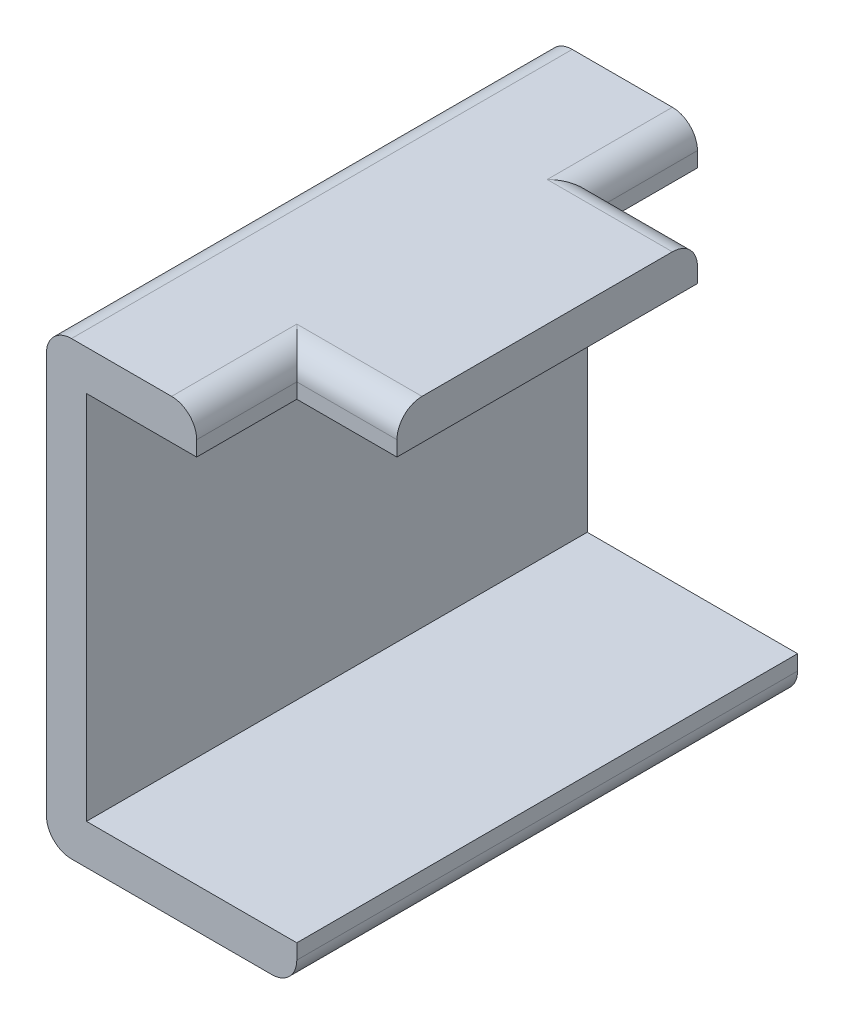
ISO-10303-21;
HEADER;
FILE_DESCRIPTION(('STEP AP214'),'2;1');
FILE_NAME('part.step','',(''),(''),'','','');
FILE_SCHEMA(('AUTOMOTIVE_DESIGN { 1 0 10303 214 1 1 1 1 }'));
ENDSEC;
DATA;
#1=APPLICATION_CONTEXT('core data for automotive mechanical design processes');
#2=APPLICATION_PROTOCOL_DEFINITION('international standard','automotive_design',2000,#1);
#3=PRODUCT_CONTEXT('',#1,'mechanical');
#4=PRODUCT('Part','Part','',(#3));
#5=PRODUCT_RELATED_PRODUCT_CATEGORY('part','',(#4));
#6=PRODUCT_DEFINITION_FORMATION('','',#4);
#7=PRODUCT_DEFINITION_CONTEXT('part definition',#1,'design');
#8=PRODUCT_DEFINITION('design','',#6,#7);
#9=PRODUCT_DEFINITION_SHAPE('','',#8);
#10=(LENGTH_UNIT() NAMED_UNIT(*) SI_UNIT(.MILLI.,.METRE.));
#11=(NAMED_UNIT(*) PLANE_ANGLE_UNIT() SI_UNIT($,.RADIAN.));
#12=(NAMED_UNIT(*) SI_UNIT($,.STERADIAN.) SOLID_ANGLE_UNIT());
#13=UNCERTAINTY_MEASURE_WITH_UNIT(LENGTH_MEASURE(1.E-05),#10,'distance_accuracy_value','');
#14=(GEOMETRIC_REPRESENTATION_CONTEXT(3) GLOBAL_UNCERTAINTY_ASSIGNED_CONTEXT((#13)) GLOBAL_UNIT_ASSIGNED_CONTEXT((#10,
#11,#12)) REPRESENTATION_CONTEXT('',''));
#15=CARTESIAN_POINT('',(0.,0.,0.));
#16=DIRECTION('',(0.,0.,1.));
#17=DIRECTION('',(1.,0.,0.));
#18=AXIS2_PLACEMENT_3D('',#15,#16,#17);
#19=CARTESIAN_POINT('',(3.818,3.4256,2.4852));
#20=DIRECTION('',(0.,-1.,0.));
#21=DIRECTION('',(0.,0.,-1.));
#22=AXIS2_PLACEMENT_3D('',#19,#20,#21);
#23=PLANE('',#22);
#24=DIRECTION('',(0.,0.,-1.));
#25=VECTOR('',#24,1.);
#26=CARTESIAN_POINT('',(4.068,3.4256,2.4852));
#27=LINE('',#26,#25);
#28=CARTESIAN_POINT('',(4.068,3.4256,2.3602));
#29=VERTEX_POINT('',#28);
#30=CARTESIAN_POINT('',(4.068,3.4256,2.1102));
#31=VERTEX_POINT('',#30);
#32=EDGE_CURVE('E11',#29,#31,#27,.T.);
#33=ORIENTED_EDGE('',*,*,#32,.T.);
#34=DIRECTION('',(-1.,0.,0.));
#35=VECTOR('',#34,1.);
#36=CARTESIAN_POINT('',(3.818,3.4256,2.1102));
#37=LINE('',#36,#35);
#38=CARTESIAN_POINT('',(3.943,3.4256,2.1102));
#39=VERTEX_POINT('',#38);
#40=EDGE_CURVE('E24',#31,#39,#37,.T.);
#41=ORIENTED_EDGE('',*,*,#40,.T.);
#42=DIRECTION('',(0.,0.,-1.));
#43=VECTOR('',#42,1.);
#44=CARTESIAN_POINT('',(3.943,3.4256,2.4852));
#45=LINE('',#44,#43);
#46=CARTESIAN_POINT('',(3.943,3.4256,1.9852));
#47=VERTEX_POINT('',#46);
#48=EDGE_CURVE('E295',#39,#47,#45,.T.);
#49=ORIENTED_EDGE('',*,*,#48,.T.);
#50=DIRECTION('',(-1.,0.,0.));
#51=VECTOR('',#50,1.);
#52=CARTESIAN_POINT('',(3.818,3.4256,1.9852));
#53=LINE('',#52,#51);
#54=CARTESIAN_POINT('',(3.843,3.4256,1.9852));
#55=VERTEX_POINT('',#54);
#56=EDGE_CURVE('E293',#47,#55,#53,.T.);
#57=ORIENTED_EDGE('',*,*,#56,.T.);
#58=DIRECTION('',(0.,0.,1.));
#59=VECTOR('',#58,1.);
#60=CARTESIAN_POINT('',(3.843,3.4256,2.4852));
#61=LINE('',#60,#59);
#62=CARTESIAN_POINT('',(3.843,3.4256,2.4852));
#63=VERTEX_POINT('',#62);
#64=EDGE_CURVE('E291',#55,#63,#61,.T.);
#65=ORIENTED_EDGE('',*,*,#64,.T.);
#66=DIRECTION('',(-1.,0.,0.));
#67=VECTOR('',#66,1.);
#68=CARTESIAN_POINT('',(3.818,3.4256,2.4852));
#69=LINE('',#68,#67);
#70=CARTESIAN_POINT('',(3.943,3.4256,2.4852));
#71=VERTEX_POINT('',#70);
#72=EDGE_CURVE('E288',#71,#63,#69,.T.);
#73=ORIENTED_EDGE('',*,*,#72,.F.);
#74=DIRECTION('',(0.,0.,-1.));
#75=VECTOR('',#74,1.);
#76=CARTESIAN_POINT('',(3.943,3.4256,2.4852));
#77=LINE('',#76,#75);
#78=CARTESIAN_POINT('',(3.943,3.4256,2.3602));
#79=VERTEX_POINT('',#78);
#80=EDGE_CURVE('E286',#71,#79,#77,.T.);
#81=ORIENTED_EDGE('',*,*,#80,.T.);
#82=DIRECTION('',(1.,0.,0.));
#83=VECTOR('',#82,1.);
#84=CARTESIAN_POINT('',(3.818,3.4256,2.3602));
#85=LINE('',#84,#83);
#86=EDGE_CURVE('E171',#79,#29,#85,.T.);
#87=ORIENTED_EDGE('',*,*,#86,.T.);
#88=EDGE_LOOP('',(#33,#41,#49,#57,#65,#73,#81,#87));
#89=FACE_BOUND('',#88,.T.);
#90=ADVANCED_FACE('F17',(#89),#23,.F.);
#91=CARTESIAN_POINT('',(3.818,2.9756,2.4852));
#92=DIRECTION('',(1.,0.,0.));
#93=DIRECTION('',(0.,0.,-1.));
#94=AXIS2_PLACEMENT_3D('',#91,#92,#93);
#95=PLANE('',#94);
#96=DIRECTION('',(0.,-1.,0.));
#97=VECTOR('',#96,1.);
#98=CARTESIAN_POINT('',(3.818,2.9756,2.4852));
#99=LINE('',#98,#97);
#100=CARTESIAN_POINT('',(3.818,3.4006,2.4852));
#101=VERTEX_POINT('',#100);
#102=CARTESIAN_POINT('',(3.818,3.0006,2.4852));
#103=VERTEX_POINT('',#102);
#104=EDGE_CURVE('E283',#101,#103,#99,.T.);
#105=ORIENTED_EDGE('',*,*,#104,.F.);
#106=DIRECTION('',(0.,0.,-1.));
#107=VECTOR('',#106,1.);
#108=CARTESIAN_POINT('',(3.818,3.4006,2.4852));
#109=LINE('',#108,#107);
#110=CARTESIAN_POINT('',(3.818,3.4006,1.9852));
#111=VERTEX_POINT('',#110);
#112=EDGE_CURVE('E281',#101,#111,#109,.T.);
#113=ORIENTED_EDGE('',*,*,#112,.T.);
#114=DIRECTION('',(0.,-1.,0.));
#115=VECTOR('',#114,1.);
#116=CARTESIAN_POINT('',(3.818,2.9756,1.9852));
#117=LINE('',#116,#115);
#118=CARTESIAN_POINT('',(3.818,3.0006,1.9852));
#119=VERTEX_POINT('',#118);
#120=EDGE_CURVE('E279',#111,#119,#117,.T.);
#121=ORIENTED_EDGE('',*,*,#120,.T.);
#122=DIRECTION('',(0.,0.,1.));
#123=VECTOR('',#122,1.);
#124=CARTESIAN_POINT('',(3.818,3.0006,2.4852));
#125=LINE('',#124,#123);
#126=EDGE_CURVE('E276',#119,#103,#125,.T.);
#127=ORIENTED_EDGE('',*,*,#126,.T.);
#128=EDGE_LOOP('',(#105,#113,#121,#127));
#129=FACE_BOUND('',#128,.T.);
#130=ADVANCED_FACE('F358',(#129),#95,.F.);
#131=CARTESIAN_POINT('',(4.068,2.9756,2.4852));
#132=DIRECTION('',(0.,1.,0.));
#133=DIRECTION('',(-1.,0.,0.));
#134=AXIS2_PLACEMENT_3D('',#131,#132,#133);
#135=PLANE('',#134);
#136=DIRECTION('',(1.,0.,0.));
#137=VECTOR('',#136,1.);
#138=CARTESIAN_POINT('',(4.068,2.9756,1.9852));
#139=LINE('',#138,#137);
#140=CARTESIAN_POINT('',(3.843,2.9756,1.9852));
#141=VERTEX_POINT('',#140);
#142=CARTESIAN_POINT('',(4.043,2.9756,1.9852));
#143=VERTEX_POINT('',#142);
#144=EDGE_CURVE('E274',#141,#143,#139,.T.);
#145=ORIENTED_EDGE('',*,*,#144,.T.);
#146=DIRECTION('',(0.,0.,1.));
#147=VECTOR('',#146,1.);
#148=CARTESIAN_POINT('',(4.043,2.9756,2.4852));
#149=LINE('',#148,#147);
#150=CARTESIAN_POINT('',(4.043,2.9756,2.4852));
#151=VERTEX_POINT('',#150);
#152=EDGE_CURVE('E272',#143,#151,#149,.T.);
#153=ORIENTED_EDGE('',*,*,#152,.T.);
#154=DIRECTION('',(1.,0.,0.));
#155=VECTOR('',#154,1.);
#156=CARTESIAN_POINT('',(4.068,2.9756,2.4852));
#157=LINE('',#156,#155);
#158=CARTESIAN_POINT('',(3.843,2.9756,2.4852));
#159=VERTEX_POINT('',#158);
#160=EDGE_CURVE('E269',#159,#151,#157,.T.);
#161=ORIENTED_EDGE('',*,*,#160,.F.);
#162=DIRECTION('',(0.,0.,-1.));
#163=VECTOR('',#162,1.);
#164=CARTESIAN_POINT('',(3.843,2.9756,2.4852));
#165=LINE('',#164,#163);
#166=EDGE_CURVE('E266',#159,#141,#165,.T.);
#167=ORIENTED_EDGE('',*,*,#166,.T.);
#168=EDGE_LOOP('',(#145,#153,#161,#167));
#169=FACE_BOUND('',#168,.T.);
#170=ADVANCED_FACE('F350',(#169),#135,.F.);
#171=CARTESIAN_POINT('',(4.068,3.0156,2.4852));
#172=DIRECTION('',(-1.,0.,0.));
#173=DIRECTION('',(0.,0.,1.));
#174=AXIS2_PLACEMENT_3D('',#171,#172,#173);
#175=PLANE('',#174);
#176=DIRECTION('',(0.,1.,0.));
#177=VECTOR('',#176,1.);
#178=CARTESIAN_POINT('',(4.068,3.0156,2.4852));
#179=LINE('',#178,#177);
#180=CARTESIAN_POINT('',(4.068,3.0006,2.4852));
#181=VERTEX_POINT('',#180);
#182=CARTESIAN_POINT('',(4.068,3.0156,2.4852));
#183=VERTEX_POINT('',#182);
#184=EDGE_CURVE('E264',#181,#183,#179,.T.);
#185=ORIENTED_EDGE('',*,*,#184,.F.);
#186=DIRECTION('',(0.,0.,-1.));
#187=VECTOR('',#186,1.);
#188=CARTESIAN_POINT('',(4.068,3.0006,2.4852));
#189=LINE('',#188,#187);
#190=CARTESIAN_POINT('',(4.068,3.0006,1.9852));
#191=VERTEX_POINT('',#190);
#192=EDGE_CURVE('E262',#181,#191,#189,.T.);
#193=ORIENTED_EDGE('',*,*,#192,.T.);
#194=DIRECTION('',(0.,1.,0.));
#195=VECTOR('',#194,1.);
#196=CARTESIAN_POINT('',(4.068,3.0156,1.9852));
#197=LINE('',#196,#195);
#198=CARTESIAN_POINT('',(4.068,3.0156,1.9852));
#199=VERTEX_POINT('',#198);
#200=EDGE_CURVE('E260',#191,#199,#197,.T.);
#201=ORIENTED_EDGE('',*,*,#200,.T.);
#202=DIRECTION('',(0.,0.,-1.));
#203=VECTOR('',#202,1.);
#204=CARTESIAN_POINT('',(4.068,3.0156,2.4852));
#205=LINE('',#204,#203);
#206=EDGE_CURVE('E257',#183,#199,#205,.T.);
#207=ORIENTED_EDGE('',*,*,#206,.F.);
#208=EDGE_LOOP('',(#185,#193,#201,#207));
#209=FACE_BOUND('',#208,.T.);
#210=ADVANCED_FACE('F365',(#209),#175,.F.);
#211=CARTESIAN_POINT('',(3.858,3.0156,2.4852));
#212=DIRECTION('',(0.,-1.,0.));
#213=DIRECTION('',(1.,0.,0.));
#214=AXIS2_PLACEMENT_3D('',#211,#212,#213);
#215=PLANE('',#214);
#216=DIRECTION('',(-1.,0.,0.));
#217=VECTOR('',#216,1.);
#218=CARTESIAN_POINT('',(3.858,3.0156,1.9852));
#219=LINE('',#218,#217);
#220=CARTESIAN_POINT('',(3.858,3.0156,1.9852));
#221=VERTEX_POINT('',#220);
#222=EDGE_CURVE('E255',#199,#221,#219,.T.);
#223=ORIENTED_EDGE('',*,*,#222,.T.);
#224=DIRECTION('',(0.,0.,-1.));
#225=VECTOR('',#224,1.);
#226=CARTESIAN_POINT('',(3.858,3.0156,2.4852));
#227=LINE('',#226,#225);
#228=CARTESIAN_POINT('',(3.858,3.0156,2.4852));
#229=VERTEX_POINT('',#228);
#230=EDGE_CURVE('E252',#229,#221,#227,.T.);
#231=ORIENTED_EDGE('',*,*,#230,.F.);
#232=DIRECTION('',(-1.,0.,0.));
#233=VECTOR('',#232,1.);
#234=CARTESIAN_POINT('',(3.858,3.0156,2.4852));
#235=LINE('',#234,#233);
#236=EDGE_CURVE('E249',#183,#229,#235,.T.);
#237=ORIENTED_EDGE('',*,*,#236,.F.);
#238=ORIENTED_EDGE('',*,*,#206,.T.);
#239=EDGE_LOOP('',(#223,#231,#237,#238));
#240=FACE_BOUND('',#239,.T.);
#241=ADVANCED_FACE('F340',(#240),#215,.F.);
#242=CARTESIAN_POINT('',(3.858,3.3856,2.4852));
#243=DIRECTION('',(-1.,0.,0.));
#244=DIRECTION('',(0.,0.,1.));
#245=AXIS2_PLACEMENT_3D('',#242,#243,#244);
#246=PLANE('',#245);
#247=DIRECTION('',(0.,1.,0.));
#248=VECTOR('',#247,1.);
#249=CARTESIAN_POINT('',(3.858,3.3856,1.9852));
#250=LINE('',#249,#248);
#251=CARTESIAN_POINT('',(3.858,3.3856,1.9852));
#252=VERTEX_POINT('',#251);
#253=EDGE_CURVE('E247',#221,#252,#250,.T.);
#254=ORIENTED_EDGE('',*,*,#253,.T.);
#255=DIRECTION('',(0.,0.,-1.));
#256=VECTOR('',#255,1.);
#257=CARTESIAN_POINT('',(3.858,3.3856,2.4852));
#258=LINE('',#257,#256);
#259=CARTESIAN_POINT('',(3.858,3.3856,2.4852));
#260=VERTEX_POINT('',#259);
#261=EDGE_CURVE('E244',#260,#252,#258,.T.);
#262=ORIENTED_EDGE('',*,*,#261,.F.);
#263=DIRECTION('',(0.,1.,0.));
#264=VECTOR('',#263,1.);
#265=CARTESIAN_POINT('',(3.858,3.3856,2.4852));
#266=LINE('',#265,#264);
#267=EDGE_CURVE('E241',#229,#260,#266,.T.);
#268=ORIENTED_EDGE('',*,*,#267,.F.);
#269=ORIENTED_EDGE('',*,*,#230,.T.);
#270=EDGE_LOOP('',(#254,#262,#268,#269));
#271=FACE_BOUND('',#270,.T.);
#272=ADVANCED_FACE('F336',(#271),#246,.F.);
#273=CARTESIAN_POINT('',(4.068,3.3856,2.4852));
#274=DIRECTION('',(0.,1.,0.));
#275=DIRECTION('',(-1.,0.,0.));
#276=AXIS2_PLACEMENT_3D('',#273,#274,#275);
#277=PLANE('',#276);
#278=DIRECTION('',(1.,0.,0.));
#279=VECTOR('',#278,1.);
#280=CARTESIAN_POINT('',(4.068,3.3856,1.9852));
#281=LINE('',#280,#279);
#282=CARTESIAN_POINT('',(3.968,3.3856,1.9852));
#283=VERTEX_POINT('',#282);
#284=EDGE_CURVE('E239',#252,#283,#281,.T.);
#285=ORIENTED_EDGE('',*,*,#284,.T.);
#286=DIRECTION('',(0.,0.,1.));
#287=VECTOR('',#286,1.);
#288=CARTESIAN_POINT('',(3.968,3.3856,1.9852));
#289=LINE('',#288,#287);
#290=CARTESIAN_POINT('',(3.968,3.3856,2.0852));
#291=VERTEX_POINT('',#290);
#292=EDGE_CURVE('E237',#283,#291,#289,.T.);
#293=ORIENTED_EDGE('',*,*,#292,.T.);
#294=DIRECTION('',(1.,0.,0.));
#295=VECTOR('',#294,1.);
#296=CARTESIAN_POINT('',(3.968,3.3856,2.0852));
#297=LINE('',#296,#295);
#298=CARTESIAN_POINT('',(4.068,3.3856,2.0852));
#299=VERTEX_POINT('',#298);
#300=EDGE_CURVE('E235',#291,#299,#297,.T.);
#301=ORIENTED_EDGE('',*,*,#300,.T.);
#302=DIRECTION('',(0.,0.,-1.));
#303=VECTOR('',#302,1.);
#304=CARTESIAN_POINT('',(4.068,3.3856,2.4852));
#305=LINE('',#304,#303);
#306=CARTESIAN_POINT('',(4.068,3.3856,2.3852));
#307=VERTEX_POINT('',#306);
#308=EDGE_CURVE('E232',#307,#299,#305,.T.);
#309=ORIENTED_EDGE('',*,*,#308,.F.);
#310=DIRECTION('',(-1.,0.,0.));
#311=VECTOR('',#310,1.);
#312=CARTESIAN_POINT('',(3.968,3.3856,2.3852));
#313=LINE('',#312,#311);
#314=CARTESIAN_POINT('',(3.968,3.3856,2.3852));
#315=VERTEX_POINT('',#314);
#316=EDGE_CURVE('E230',#307,#315,#313,.T.);
#317=ORIENTED_EDGE('',*,*,#316,.T.);
#318=DIRECTION('',(0.,0.,1.));
#319=VECTOR('',#318,1.);
#320=CARTESIAN_POINT('',(3.968,3.3856,2.4852));
#321=LINE('',#320,#319);
#322=CARTESIAN_POINT('',(3.968,3.3856,2.4852));
#323=VERTEX_POINT('',#322);
#324=EDGE_CURVE('E157',#315,#323,#321,.T.);
#325=ORIENTED_EDGE('',*,*,#324,.T.);
#326=DIRECTION('',(1.,0.,0.));
#327=VECTOR('',#326,1.);
#328=CARTESIAN_POINT('',(4.068,3.3856,2.4852));
#329=LINE('',#328,#327);
#330=EDGE_CURVE('E226',#260,#323,#329,.T.);
#331=ORIENTED_EDGE('',*,*,#330,.F.);
#332=ORIENTED_EDGE('',*,*,#261,.T.);
#333=EDGE_LOOP('',(#285,#293,#301,#309,#317,#325,#331,#332));
#334=FACE_BOUND('',#333,.T.);
#335=ADVANCED_FACE('F332',(#334),#277,.F.);
#336=CARTESIAN_POINT('',(4.068,3.4256,2.4852));
#337=DIRECTION('',(-1.,0.,0.));
#338=DIRECTION('',(0.,0.,1.));
#339=AXIS2_PLACEMENT_3D('',#336,#337,#338);
#340=PLANE('',#339);
#341=DIRECTION('',(0.,1.,0.));
#342=VECTOR('',#341,1.);
#343=CARTESIAN_POINT('',(4.068,3.4256,2.0852));
#344=LINE('',#343,#342);
#345=CARTESIAN_POINT('',(4.068,3.4006,2.0852));
#346=VERTEX_POINT('',#345);
#347=EDGE_CURVE('E224',#299,#346,#344,.T.);
#348=ORIENTED_EDGE('',*,*,#347,.T.);
#349=CARTESIAN_POINT('',(4.068,3.4006,2.1102));
#350=DIRECTION('',(1.,0.,0.));
#351=DIRECTION('',(0.,0.,1.));
#352=AXIS2_PLACEMENT_3D('',#349,#350,#351);
#353=CIRCLE('',#352,0.0249999999999998);
#354=EDGE_CURVE('E222',#346,#31,#353,.T.);
#355=ORIENTED_EDGE('',*,*,#354,.T.);
#356=ORIENTED_EDGE('',*,*,#32,.F.);
#357=CARTESIAN_POINT('',(4.068,3.4006,2.3602));
#358=DIRECTION('',(1.,0.,0.));
#359=DIRECTION('',(0.,0.,1.));
#360=AXIS2_PLACEMENT_3D('',#357,#358,#359);
#361=CIRCLE('',#360,0.0249999999999998);
#362=CARTESIAN_POINT('',(4.068,3.4006,2.3852));
#363=VERTEX_POINT('',#362);
#364=EDGE_CURVE('E220',#29,#363,#361,.T.);
#365=ORIENTED_EDGE('',*,*,#364,.T.);
#366=DIRECTION('',(0.,-1.,0.));
#367=VECTOR('',#366,1.);
#368=CARTESIAN_POINT('',(4.068,3.4256,2.3852));
#369=LINE('',#368,#367);
#370=EDGE_CURVE('E144',#363,#307,#369,.T.);
#371=ORIENTED_EDGE('',*,*,#370,.T.);
#372=ORIENTED_EDGE('',*,*,#308,.T.);
#373=EDGE_LOOP('',(#348,#355,#356,#365,#371,#372));
#374=FACE_BOUND('',#373,.T.);
#375=ADVANCED_FACE('F328',(#374),#340,.F.);
#376=CARTESIAN_POINT('',(4.318,2.9756,2.4852));
#377=DIRECTION('',(0.,0.,-1.));
#378=DIRECTION('',(-1.,0.,0.));
#379=AXIS2_PLACEMENT_3D('',#376,#377,#378);
#380=PLANE('',#379);
#381=ORIENTED_EDGE('',*,*,#160,.T.);
#382=CARTESIAN_POINT('',(4.043,3.0006,2.4852));
#383=DIRECTION('',(0.,0.,1.));
#384=DIRECTION('',(-1.,0.,0.));
#385=AXIS2_PLACEMENT_3D('',#382,#383,#384);
#386=CIRCLE('',#385,0.0249999999999998);
#387=EDGE_CURVE('E216',#151,#181,#386,.T.);
#388=ORIENTED_EDGE('',*,*,#387,.T.);
#389=ORIENTED_EDGE('',*,*,#184,.T.);
#390=ORIENTED_EDGE('',*,*,#236,.T.);
#391=ORIENTED_EDGE('',*,*,#267,.T.);
#392=ORIENTED_EDGE('',*,*,#330,.T.);
#393=DIRECTION('',(0.,1.,0.));
#394=VECTOR('',#393,1.);
#395=CARTESIAN_POINT('',(3.968,3.3856,2.4852));
#396=LINE('',#395,#394);
#397=CARTESIAN_POINT('',(3.968,3.4006,2.4852));
#398=VERTEX_POINT('',#397);
#399=EDGE_CURVE('E214',#323,#398,#396,.T.);
#400=ORIENTED_EDGE('',*,*,#399,.T.);
#401=CARTESIAN_POINT('',(3.943,3.4006,2.4852));
#402=DIRECTION('',(0.,0.,1.));
#403=DIRECTION('',(-1.,0.,0.));
#404=AXIS2_PLACEMENT_3D('',#401,#402,#403);
#405=CIRCLE('',#404,0.0249999999999998);
#406=EDGE_CURVE('E166',#398,#71,#405,.T.);
#407=ORIENTED_EDGE('',*,*,#406,.T.);
#408=ORIENTED_EDGE('',*,*,#72,.T.);
#409=CARTESIAN_POINT('',(3.843,3.4006,2.4852));
#410=DIRECTION('',(0.,0.,1.));
#411=DIRECTION('',(-1.,0.,0.));
#412=AXIS2_PLACEMENT_3D('',#409,#410,#411);
#413=CIRCLE('',#412,0.0249999999999998);
#414=EDGE_CURVE('E210',#63,#101,#413,.T.);
#415=ORIENTED_EDGE('',*,*,#414,.T.);
#416=ORIENTED_EDGE('',*,*,#104,.T.);
#417=CARTESIAN_POINT('',(3.843,3.0006,2.4852));
#418=DIRECTION('',(0.,0.,1.));
#419=DIRECTION('',(-1.,0.,0.));
#420=AXIS2_PLACEMENT_3D('',#417,#418,#419);
#421=CIRCLE('',#420,0.0249999999999998);
#422=EDGE_CURVE('E207',#103,#159,#421,.T.);
#423=ORIENTED_EDGE('',*,*,#422,.T.);
#424=EDGE_LOOP('',(#381,#388,#389,#390,#391,#392,#400,#407,#408,#415,#416,#423));
#425=FACE_BOUND('',#424,.T.);
#426=ADVANCED_FACE('F327',(#425),#380,.F.);
#427=CARTESIAN_POINT('',(4.318,2.9756,1.9852));
#428=DIRECTION('',(0.,0.,-1.));
#429=DIRECTION('',(-1.,0.,0.));
#430=AXIS2_PLACEMENT_3D('',#427,#428,#429);
#431=PLANE('',#430);
#432=ORIENTED_EDGE('',*,*,#200,.F.);
#433=CARTESIAN_POINT('',(4.043,3.0006,1.9852));
#434=DIRECTION('',(0.,0.,-1.));
#435=DIRECTION('',(-1.,0.,0.));
#436=AXIS2_PLACEMENT_3D('',#433,#434,#435);
#437=CIRCLE('',#436,0.0249999999999998);
#438=EDGE_CURVE('E204',#191,#143,#437,.T.);
#439=ORIENTED_EDGE('',*,*,#438,.T.);
#440=ORIENTED_EDGE('',*,*,#144,.F.);
#441=CARTESIAN_POINT('',(3.843,3.0006,1.9852));
#442=DIRECTION('',(0.,0.,-1.));
#443=DIRECTION('',(-1.,0.,0.));
#444=AXIS2_PLACEMENT_3D('',#441,#442,#443);
#445=CIRCLE('',#444,0.0249999999999998);
#446=EDGE_CURVE('E201',#141,#119,#445,.T.);
#447=ORIENTED_EDGE('',*,*,#446,.T.);
#448=ORIENTED_EDGE('',*,*,#120,.F.);
#449=CARTESIAN_POINT('',(3.843,3.4006,1.9852));
#450=DIRECTION('',(0.,0.,-1.));
#451=DIRECTION('',(-1.,0.,0.));
#452=AXIS2_PLACEMENT_3D('',#449,#450,#451);
#453=CIRCLE('',#452,0.0249999999999998);
#454=EDGE_CURVE('E198',#111,#55,#453,.T.);
#455=ORIENTED_EDGE('',*,*,#454,.T.);
#456=ORIENTED_EDGE('',*,*,#56,.F.);
#457=CARTESIAN_POINT('',(3.943,3.4006,1.9852));
#458=DIRECTION('',(0.,0.,-1.));
#459=DIRECTION('',(-1.,0.,0.));
#460=AXIS2_PLACEMENT_3D('',#457,#458,#459);
#461=CIRCLE('',#460,0.0249999999999998);
#462=CARTESIAN_POINT('',(3.968,3.4006,1.9852));
#463=VERTEX_POINT('',#462);
#464=EDGE_CURVE('E196',#47,#463,#461,.T.);
#465=ORIENTED_EDGE('',*,*,#464,.T.);
#466=DIRECTION('',(0.,1.,0.));
#467=VECTOR('',#466,1.);
#468=CARTESIAN_POINT('',(3.968,3.3856,1.9852));
#469=LINE('',#468,#467);
#470=EDGE_CURVE('E193',#283,#463,#469,.T.);
#471=ORIENTED_EDGE('',*,*,#470,.F.);
#472=ORIENTED_EDGE('',*,*,#284,.F.);
#473=ORIENTED_EDGE('',*,*,#253,.F.);
#474=ORIENTED_EDGE('',*,*,#222,.F.);
#475=EDGE_LOOP('',(#432,#439,#440,#447,#448,#455,#456,#465,#471,#472,#473,#474));
#476=FACE_BOUND('',#475,.T.);
#477=ADVANCED_FACE('F317',(#476),#431,.T.);
#478=CARTESIAN_POINT('',(3.968,3.3856,2.0852));
#479=DIRECTION('',(0.,0.,1.));
#480=DIRECTION('',(1.,0.,0.));
#481=AXIS2_PLACEMENT_3D('',#478,#479,#480);
#482=PLANE('',#481);
#483=DIRECTION('',(0.,1.,0.));
#484=VECTOR('',#483,1.);
#485=CARTESIAN_POINT('',(3.968,3.3856,2.0852));
#486=LINE('',#485,#484);
#487=CARTESIAN_POINT('',(3.968,3.4006,2.0852));
#488=VERTEX_POINT('',#487);
#489=EDGE_CURVE('E191',#291,#488,#486,.T.);
#490=ORIENTED_EDGE('',*,*,#489,.T.);
#491=DIRECTION('',(1.,0.,0.));
#492=VECTOR('',#491,1.);
#493=CARTESIAN_POINT('',(3.968,3.4006,2.0852));
#494=LINE('',#493,#492);
#495=EDGE_CURVE('E188',#488,#346,#494,.T.);
#496=ORIENTED_EDGE('',*,*,#495,.T.);
#497=ORIENTED_EDGE('',*,*,#347,.F.);
#498=ORIENTED_EDGE('',*,*,#300,.F.);
#499=EDGE_LOOP('',(#490,#496,#497,#498));
#500=FACE_BOUND('',#499,.T.);
#501=ADVANCED_FACE('F331',(#500),#482,.F.);
#502=CARTESIAN_POINT('',(3.968,3.3856,1.9852));
#503=DIRECTION('',(-1.,0.,0.));
#504=DIRECTION('',(0.,0.,1.));
#505=AXIS2_PLACEMENT_3D('',#502,#503,#504);
#506=PLANE('',#505);
#507=ORIENTED_EDGE('',*,*,#470,.T.);
#508=DIRECTION('',(0.,0.,1.));
#509=VECTOR('',#508,1.);
#510=CARTESIAN_POINT('',(3.968,3.4006,1.9852));
#511=LINE('',#510,#509);
#512=EDGE_CURVE('E148',#463,#488,#511,.T.);
#513=ORIENTED_EDGE('',*,*,#512,.T.);
#514=ORIENTED_EDGE('',*,*,#489,.F.);
#515=ORIENTED_EDGE('',*,*,#292,.F.);
#516=EDGE_LOOP('',(#507,#513,#514,#515));
#517=FACE_BOUND('',#516,.T.);
#518=ADVANCED_FACE('F311',(#517),#506,.F.);
#519=CARTESIAN_POINT('',(3.968,3.3856,2.3852));
#520=DIRECTION('',(0.,0.,-1.));
#521=DIRECTION('',(-1.,0.,0.));
#522=AXIS2_PLACEMENT_3D('',#519,#520,#521);
#523=PLANE('',#522);
#524=ORIENTED_EDGE('',*,*,#370,.F.);
#525=DIRECTION('',(-1.,0.,0.));
#526=VECTOR('',#525,1.);
#527=CARTESIAN_POINT('',(3.968,3.4006,2.3852));
#528=LINE('',#527,#526);
#529=CARTESIAN_POINT('',(3.968,3.4006,2.3852));
#530=VERTEX_POINT('',#529);
#531=EDGE_CURVE('E138',#363,#530,#528,.T.);
#532=ORIENTED_EDGE('',*,*,#531,.T.);
#533=DIRECTION('',(0.,1.,0.));
#534=VECTOR('',#533,1.);
#535=CARTESIAN_POINT('',(3.968,3.3856,2.3852));
#536=LINE('',#535,#534);
#537=EDGE_CURVE('E142',#315,#530,#536,.T.);
#538=ORIENTED_EDGE('',*,*,#537,.F.);
#539=ORIENTED_EDGE('',*,*,#316,.F.);
#540=EDGE_LOOP('',(#524,#532,#538,#539));
#541=FACE_BOUND('',#540,.T.);
#542=ADVANCED_FACE('F140',(#541),#523,.F.);
#543=CARTESIAN_POINT('',(3.968,3.3856,2.4852));
#544=DIRECTION('',(-1.,0.,0.));
#545=DIRECTION('',(0.,0.,1.));
#546=AXIS2_PLACEMENT_3D('',#543,#544,#545);
#547=PLANE('',#546);
#548=ORIENTED_EDGE('',*,*,#537,.T.);
#549=DIRECTION('',(0.,0.,1.));
#550=VECTOR('',#549,1.);
#551=CARTESIAN_POINT('',(3.968,3.4006,2.4852));
#552=LINE('',#551,#550);
#553=EDGE_CURVE('E156',#530,#398,#552,.T.);
#554=ORIENTED_EDGE('',*,*,#553,.T.);
#555=ORIENTED_EDGE('',*,*,#399,.F.);
#556=ORIENTED_EDGE('',*,*,#324,.F.);
#557=EDGE_LOOP('',(#548,#554,#555,#556));
#558=FACE_BOUND('',#557,.T.);
#559=ADVANCED_FACE('F154',(#558),#547,.F.);
#560=CARTESIAN_POINT('',(4.043,3.0006,2.4852));
#561=DIRECTION('',(0.,0.,-1.));
#562=DIRECTION('',(-1.,0.,0.));
#563=AXIS2_PLACEMENT_3D('',#560,#561,#562);
#564=CYLINDRICAL_SURFACE('',#563,0.0249999999999998);
#565=ORIENTED_EDGE('',*,*,#387,.F.);
#566=ORIENTED_EDGE('',*,*,#152,.F.);
#567=ORIENTED_EDGE('',*,*,#438,.F.);
#568=ORIENTED_EDGE('',*,*,#192,.F.);
#569=EDGE_LOOP('',(#565,#566,#567,#568));
#570=FACE_BOUND('',#569,.T.);
#571=ADVANCED_FACE('F348',(#570),#564,.T.);
#572=CARTESIAN_POINT('',(3.943,3.4006,1.9852));
#573=DIRECTION('',(0.,0.,1.));
#574=DIRECTION('',(1.,0.,0.));
#575=AXIS2_PLACEMENT_3D('',#572,#573,#574);
#576=CYLINDRICAL_SURFACE('',#575,0.0249999999999998);
#577=ORIENTED_EDGE('',*,*,#464,.F.);
#578=ORIENTED_EDGE('',*,*,#48,.F.);
#579=CARTESIAN_POINT('',(3.968,3.4006,2.0852));
#580=CARTESIAN_POINT('',(3.96800000000003,3.41524466094068,2.08519999999997));
#581=CARTESIAN_POINT('',(3.95764466094074,3.42559999999997,2.09555533905938));
#582=CARTESIAN_POINT('',(3.943,3.4256,2.1102));
#583=(BOUNDED_CURVE() B_SPLINE_CURVE(3,(#579,#580,#581,#582),.UNSPECIFIED.,.F.,
.F.) B_SPLINE_CURVE_WITH_KNOTS((4,4),(0.,1.5707963267949),
.UNSPECIFIED.) CURVE() GEOMETRIC_REPRESENTATION_ITEM() RATIONAL_B_SPLINE_CURVE((1.,
0.804737854124365,0.804737854124365,1.)) REPRESENTATION_ITEM(''));
#584=EDGE_CURVE('E167',#488,#39,#583,.T.);
#585=ORIENTED_EDGE('',*,*,#584,.F.);
#586=ORIENTED_EDGE('',*,*,#512,.F.);
#587=EDGE_LOOP('',(#577,#578,#585,#586));
#588=FACE_BOUND('',#587,.T.);
#589=ADVANCED_FACE('F303',(#588),#576,.T.);
#590=CARTESIAN_POINT('',(3.968,3.4006,2.1102));
#591=DIRECTION('',(1.,0.,0.));
#592=DIRECTION('',(0.,0.,-1.));
#593=AXIS2_PLACEMENT_3D('',#590,#591,#592);
#594=CYLINDRICAL_SURFACE('',#593,0.0249999999999998);
#595=ORIENTED_EDGE('',*,*,#584,.T.);
#596=ORIENTED_EDGE('',*,*,#40,.F.);
#597=ORIENTED_EDGE('',*,*,#354,.F.);
#598=ORIENTED_EDGE('',*,*,#495,.F.);
#599=EDGE_LOOP('',(#595,#596,#597,#598));
#600=FACE_BOUND('',#599,.T.);
#601=ADVANCED_FACE('F306',(#600),#594,.T.);
#602=CARTESIAN_POINT('',(3.943,3.4006,2.4852));
#603=DIRECTION('',(0.,0.,1.));
#604=DIRECTION('',(1.,0.,0.));
#605=AXIS2_PLACEMENT_3D('',#602,#603,#604);
#606=CYLINDRICAL_SURFACE('',#605,0.0249999999999998);
#607=ORIENTED_EDGE('',*,*,#406,.F.);
#608=ORIENTED_EDGE('',*,*,#553,.F.);
#609=CARTESIAN_POINT('',(3.943,3.4256,2.3602));
#610=CARTESIAN_POINT('',(3.95764466094074,3.42559999999997,2.37484466094067));
#611=CARTESIAN_POINT('',(3.96800000000003,3.41524466094068,2.38519999999996));
#612=CARTESIAN_POINT('',(3.968,3.4006,2.3852));
#613=(BOUNDED_CURVE() B_SPLINE_CURVE(3,(#609,#610,#611,#612),.UNSPECIFIED.,.F.,
.F.) B_SPLINE_CURVE_WITH_KNOTS((4,4),(1.5707963267949,3.14159265358979),
.UNSPECIFIED.) CURVE() GEOMETRIC_REPRESENTATION_ITEM() RATIONAL_B_SPLINE_CURVE((1.,
0.804737854124365,0.804737854124365,1.)) REPRESENTATION_ITEM(''));
#614=EDGE_CURVE('E164',#79,#530,#613,.T.);
#615=ORIENTED_EDGE('',*,*,#614,.F.);
#616=ORIENTED_EDGE('',*,*,#80,.F.);
#617=EDGE_LOOP('',(#607,#608,#615,#616));
#618=FACE_BOUND('',#617,.T.);
#619=ADVANCED_FACE('F162',(#618),#606,.T.);
#620=CARTESIAN_POINT('',(3.968,3.4006,2.3602));
#621=DIRECTION('',(-1.,0.,0.));
#622=DIRECTION('',(0.,0.,1.));
#623=AXIS2_PLACEMENT_3D('',#620,#621,#622);
#624=CYLINDRICAL_SURFACE('',#623,0.0249999999999998);
#625=ORIENTED_EDGE('',*,*,#364,.F.);
#626=ORIENTED_EDGE('',*,*,#86,.F.);
#627=ORIENTED_EDGE('',*,*,#614,.T.);
#628=ORIENTED_EDGE('',*,*,#531,.F.);
#629=EDGE_LOOP('',(#625,#626,#627,#628));
#630=FACE_BOUND('',#629,.T.);
#631=ADVANCED_FACE('F170',(#630),#624,.T.);
#632=CARTESIAN_POINT('',(3.843,3.4006,2.4852));
#633=DIRECTION('',(0.,0.,-1.));
#634=DIRECTION('',(-1.,0.,0.));
#635=AXIS2_PLACEMENT_3D('',#632,#633,#634);
#636=CYLINDRICAL_SURFACE('',#635,0.0249999999999998);
#637=ORIENTED_EDGE('',*,*,#414,.F.);
#638=ORIENTED_EDGE('',*,*,#64,.F.);
#639=ORIENTED_EDGE('',*,*,#454,.F.);
#640=ORIENTED_EDGE('',*,*,#112,.F.);
#641=EDGE_LOOP('',(#637,#638,#639,#640));
#642=FACE_BOUND('',#641,.T.);
#643=ADVANCED_FACE('F324',(#642),#636,.T.);
#644=CARTESIAN_POINT('',(3.843,3.0006,2.4852));
#645=DIRECTION('',(0.,0.,-1.));
#646=DIRECTION('',(-1.,0.,0.));
#647=AXIS2_PLACEMENT_3D('',#644,#645,#646);
#648=CYLINDRICAL_SURFACE('',#647,0.0249999999999998);
#649=ORIENTED_EDGE('',*,*,#422,.F.);
#650=ORIENTED_EDGE('',*,*,#126,.F.);
#651=ORIENTED_EDGE('',*,*,#446,.F.);
#652=ORIENTED_EDGE('',*,*,#166,.F.);
#653=EDGE_LOOP('',(#649,#650,#651,#652));
#654=FACE_BOUND('',#653,.T.);
#655=ADVANCED_FACE('F355',(#654),#648,.T.);
#656=CLOSED_SHELL('',(#90,#130,#170,#210,#241,#272,#335,#375,#426,#477,#501,#518,#542,#559,#571,
#589,#601,#619,#631,#643,#655));
#657=MANIFOLD_SOLID_BREP('B1',#656);
#658=ADVANCED_BREP_SHAPE_REPRESENTATION('',(#18,#657),#14);
#659=SHAPE_DEFINITION_REPRESENTATION(#9,#658);
ENDSEC;
END-ISO-10303-21;
